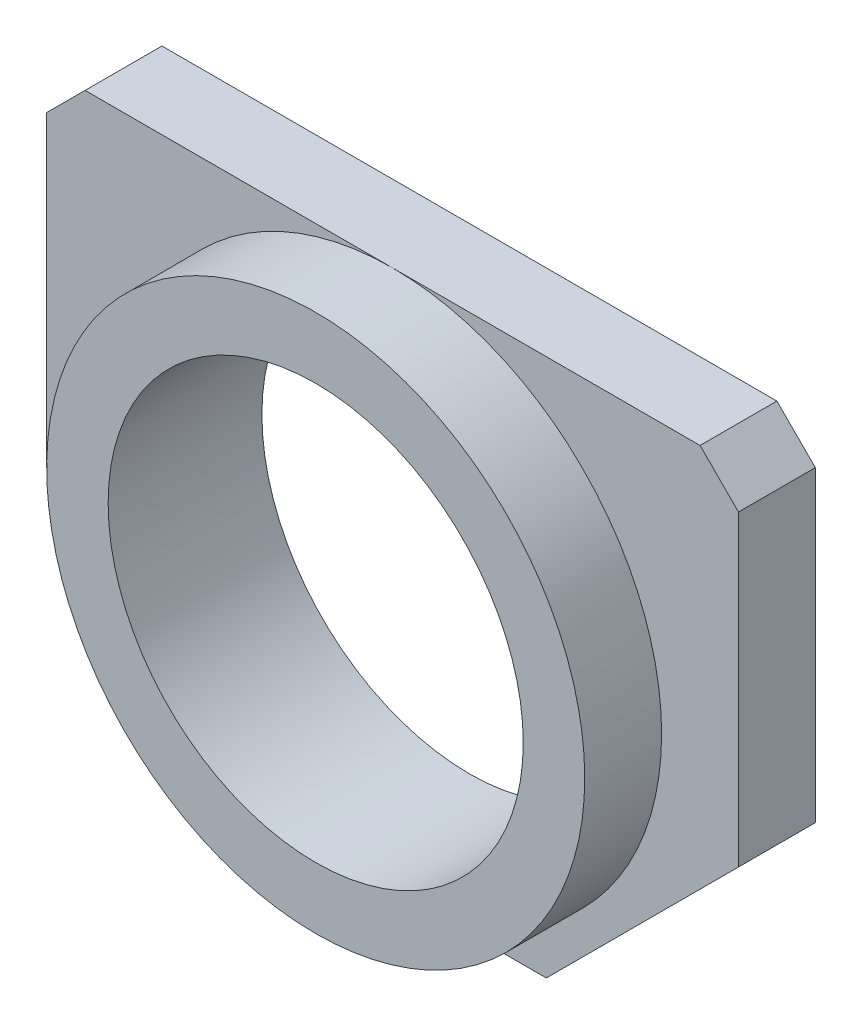
ISO-10303-21;
HEADER;
FILE_DESCRIPTION(('STEP AP214'),'2;1');
FILE_NAME('part.step','',(''),(''),'','','');
FILE_SCHEMA(('AUTOMOTIVE_DESIGN { 1 0 10303 214 1 1 1 1 }'));
ENDSEC;
DATA;
#1=APPLICATION_CONTEXT('core data for automotive mechanical design processes');
#2=APPLICATION_PROTOCOL_DEFINITION('international standard','automotive_design',2000,#1);
#3=PRODUCT_CONTEXT('',#1,'mechanical');
#4=PRODUCT('Part','Part','',(#3));
#5=PRODUCT_RELATED_PRODUCT_CATEGORY('part','',(#4));
#6=PRODUCT_DEFINITION_FORMATION('','',#4);
#7=PRODUCT_DEFINITION_CONTEXT('part definition',#1,'design');
#8=PRODUCT_DEFINITION('design','',#6,#7);
#9=PRODUCT_DEFINITION_SHAPE('','',#8);
#10=(LENGTH_UNIT() NAMED_UNIT(*) SI_UNIT(.MILLI.,.METRE.));
#11=(NAMED_UNIT(*) PLANE_ANGLE_UNIT() SI_UNIT($,.RADIAN.));
#12=(NAMED_UNIT(*) SI_UNIT($,.STERADIAN.) SOLID_ANGLE_UNIT());
#13=UNCERTAINTY_MEASURE_WITH_UNIT(LENGTH_MEASURE(1.E-05),#10,'distance_accuracy_value','');
#14=(GEOMETRIC_REPRESENTATION_CONTEXT(3) GLOBAL_UNCERTAINTY_ASSIGNED_CONTEXT((#13)) GLOBAL_UNIT_ASSIGNED_CONTEXT((#10,
#11,#12)) REPRESENTATION_CONTEXT('',''));
#15=CARTESIAN_POINT('',(0.,0.,0.));
#16=DIRECTION('',(0.,0.,1.));
#17=DIRECTION('',(1.,0.,0.));
#18=AXIS2_PLACEMENT_3D('',#15,#16,#17);
#19=CARTESIAN_POINT('',(9.,7.,2.));
#20=DIRECTION('',(0.,0.,-1.));
#21=DIRECTION('',(-1.,0.,0.));
#22=AXIS2_PLACEMENT_3D('',#19,#20,#21);
#23=PLANE('',#22);
#24=DIRECTION('',(-1.,0.,0.));
#25=VECTOR('',#24,1.);
#26=CARTESIAN_POINT('',(-9.,7.,2.));
#27=LINE('',#26,#25);
#28=CARTESIAN_POINT('',(0.,7.,2.));
#29=VERTEX_POINT('',#28);
#30=CARTESIAN_POINT('',(-8.,7.,2.));
#31=VERTEX_POINT('',#30);
#32=EDGE_CURVE('E116',#29,#31,#27,.T.);
#33=ORIENTED_EDGE('',*,*,#32,.T.);
#34=DIRECTION('',(0.707106781186548,0.707106781186548,0.));
#35=VECTOR('',#34,1.);
#36=CARTESIAN_POINT('',(-9.,6.,2.));
#37=LINE('',#36,#35);
#38=CARTESIAN_POINT('',(-9.00000000000001,5.99999999999999,2.));
#39=VERTEX_POINT('',#38);
#40=EDGE_CURVE('E11',#31,#39,#37,.F.);
#41=ORIENTED_EDGE('',*,*,#40,.T.);
#42=DIRECTION('',(0.,-1.,0.));
#43=VECTOR('',#42,1.);
#44=CARTESIAN_POINT('',(-9.,-7.,2.));
#45=LINE('',#44,#43);
#46=CARTESIAN_POINT('',(-9.00000000000001,-1.99999999999998,2.));
#47=VERTEX_POINT('',#46);
#48=EDGE_CURVE('E115',#39,#47,#45,.T.);
#49=ORIENTED_EDGE('',*,*,#48,.T.);
#50=DIRECTION('',(-0.707106781186546,0.707106781186549,0.));
#51=VECTOR('',#50,1.);
#52=CARTESIAN_POINT('',(-4.,-7.,2.));
#53=LINE('',#52,#51);
#54=CARTESIAN_POINT('',(-4.,-7.,2.));
#55=VERTEX_POINT('',#54);
#56=EDGE_CURVE('E167',#47,#55,#53,.F.);
#57=ORIENTED_EDGE('',*,*,#56,.T.);
#58=DIRECTION('',(1.,0.,0.));
#59=VECTOR('',#58,1.);
#60=CARTESIAN_POINT('',(-9.,-7.,2.));
#61=LINE('',#60,#59);
#62=CARTESIAN_POINT('',(0.,-7.,2.));
#63=VERTEX_POINT('',#62);
#64=EDGE_CURVE('E127',#55,#63,#61,.T.);
#65=ORIENTED_EDGE('',*,*,#64,.T.);
#66=CARTESIAN_POINT('',(0.,0.,2.));
#67=DIRECTION('',(0.,0.,1.));
#68=DIRECTION('',(1.,0.,0.));
#69=AXIS2_PLACEMENT_3D('',#66,#67,#68);
#70=CIRCLE('',#69,7.);
#71=EDGE_CURVE('E125',#29,#63,#70,.T.);
#72=ORIENTED_EDGE('',*,*,#71,.F.);
#73=EDGE_LOOP('',(#33,#41,#49,#57,#65,#72));
#74=FACE_BOUND('',#73,.T.);
#75=ADVANCED_FACE('F31',(#74),#23,.F.);
#76=DIRECTION('',(0.,1.,0.));
#77=VECTOR('',#76,1.);
#78=CARTESIAN_POINT('',(9.,-7.,2.));
#79=LINE('',#78,#77);
#80=CARTESIAN_POINT('',(9.,-2.,2.));
#81=VERTEX_POINT('',#80);
#82=CARTESIAN_POINT('',(9.,5.99999999999999,2.));
#83=VERTEX_POINT('',#82);
#84=EDGE_CURVE('E123',#81,#83,#79,.T.);
#85=ORIENTED_EDGE('',*,*,#84,.T.);
#86=DIRECTION('',(0.707106781186546,-0.707106781186549,0.));
#87=VECTOR('',#86,1.);
#88=CARTESIAN_POINT('',(7.99999999999999,7.,2.));
#89=LINE('',#88,#87);
#90=CARTESIAN_POINT('',(7.99999999999999,7.,2.));
#91=VERTEX_POINT('',#90);
#92=EDGE_CURVE('E111',#83,#91,#89,.F.);
#93=ORIENTED_EDGE('',*,*,#92,.T.);
#94=EDGE_CURVE('E103',#91,#29,#27,.T.);
#95=ORIENTED_EDGE('',*,*,#94,.T.);
#96=EDGE_CURVE('E108',#63,#29,#70,.T.);
#97=ORIENTED_EDGE('',*,*,#96,.F.);
#98=CARTESIAN_POINT('',(3.99999999999997,-7.,2.));
#99=VERTEX_POINT('',#98);
#100=EDGE_CURVE('E137',#63,#99,#61,.T.);
#101=ORIENTED_EDGE('',*,*,#100,.T.);
#102=DIRECTION('',(-0.707106781186549,-0.707106781186546,0.));
#103=VECTOR('',#102,1.);
#104=CARTESIAN_POINT('',(9.,-2.,2.));
#105=LINE('',#104,#103);
#106=EDGE_CURVE('E162',#99,#81,#105,.F.);
#107=ORIENTED_EDGE('',*,*,#106,.T.);
#108=EDGE_LOOP('',(#85,#93,#95,#97,#101,#107));
#109=FACE_BOUND('',#108,.T.);
#110=ADVANCED_FACE('F105',(#109),#23,.F.);
#111=CARTESIAN_POINT('',(9.,-7.,2.));
#112=DIRECTION('',(-1.,0.,0.));
#113=DIRECTION('',(0.,0.,1.));
#114=AXIS2_PLACEMENT_3D('',#111,#112,#113);
#115=PLANE('',#114);
#116=DIRECTION('',(0.,1.,0.));
#117=VECTOR('',#116,1.);
#118=CARTESIAN_POINT('',(9.,-7.,0.));
#119=LINE('',#118,#117);
#120=CARTESIAN_POINT('',(8.99999999999999,-2.,0.));
#121=VERTEX_POINT('',#120);
#122=CARTESIAN_POINT('',(9.,5.99999999999999,0.));
#123=VERTEX_POINT('',#122);
#124=EDGE_CURVE('E145',#121,#123,#119,.T.);
#125=ORIENTED_EDGE('',*,*,#124,.T.);
#126=DIRECTION('',(0.,0.,1.));
#127=VECTOR('',#126,1.);
#128=CARTESIAN_POINT('',(9.,5.99999999999999,2.));
#129=LINE('',#128,#127);
#130=EDGE_CURVE('E52',#123,#83,#129,.T.);
#131=ORIENTED_EDGE('',*,*,#130,.T.);
#132=ORIENTED_EDGE('',*,*,#84,.F.);
#133=DIRECTION('',(0.,0.,-1.));
#134=VECTOR('',#133,1.);
#135=CARTESIAN_POINT('',(9.,-2.,2.));
#136=LINE('',#135,#134);
#137=EDGE_CURVE('E133',#81,#121,#136,.T.);
#138=ORIENTED_EDGE('',*,*,#137,.T.);
#139=EDGE_LOOP('',(#125,#131,#132,#138));
#140=FACE_BOUND('',#139,.T.);
#141=ADVANCED_FACE('F200',(#140),#115,.F.);
#142=CARTESIAN_POINT('',(-9.,7.,2.));
#143=DIRECTION('',(0.,-1.,0.));
#144=DIRECTION('',(0.,0.,-1.));
#145=AXIS2_PLACEMENT_3D('',#142,#143,#144);
#146=PLANE('',#145);
#147=ORIENTED_EDGE('',*,*,#94,.F.);
#148=DIRECTION('',(0.,0.,-1.));
#149=VECTOR('',#148,1.);
#150=CARTESIAN_POINT('',(7.99999999999999,7.,2.));
#151=LINE('',#150,#149);
#152=CARTESIAN_POINT('',(7.99999999999999,7.,0.));
#153=VERTEX_POINT('',#152);
#154=EDGE_CURVE('E170',#91,#153,#151,.T.);
#155=ORIENTED_EDGE('',*,*,#154,.T.);
#156=DIRECTION('',(-1.,0.,0.));
#157=VECTOR('',#156,1.);
#158=CARTESIAN_POINT('',(-9.,7.,0.));
#159=LINE('',#158,#157);
#160=CARTESIAN_POINT('',(-8.,7.,0.));
#161=VERTEX_POINT('',#160);
#162=EDGE_CURVE('E147',#153,#161,#159,.T.);
#163=ORIENTED_EDGE('',*,*,#162,.T.);
#164=DIRECTION('',(0.,0.,1.));
#165=VECTOR('',#164,1.);
#166=CARTESIAN_POINT('',(-8.,7.,2.));
#167=LINE('',#166,#165);
#168=EDGE_CURVE('E122',#161,#31,#167,.T.);
#169=ORIENTED_EDGE('',*,*,#168,.T.);
#170=ORIENTED_EDGE('',*,*,#32,.F.);
#171=EDGE_LOOP('',(#147,#155,#163,#169,#170));
#172=FACE_BOUND('',#171,.T.);
#173=ADVANCED_FACE('F119',(#172),#146,.F.);
#174=CARTESIAN_POINT('',(-9.,-7.,2.));
#175=DIRECTION('',(1.,0.,0.));
#176=DIRECTION('',(0.,0.,-1.));
#177=AXIS2_PLACEMENT_3D('',#174,#175,#176);
#178=PLANE('',#177);
#179=ORIENTED_EDGE('',*,*,#48,.F.);
#180=DIRECTION('',(0.,0.,-1.));
#181=VECTOR('',#180,1.);
#182=CARTESIAN_POINT('',(-9.,6.,2.));
#183=LINE('',#182,#181);
#184=CARTESIAN_POINT('',(-9.00000000000001,5.99999999999999,0.));
#185=VERTEX_POINT('',#184);
#186=EDGE_CURVE('E39',#39,#185,#183,.T.);
#187=ORIENTED_EDGE('',*,*,#186,.T.);
#188=DIRECTION('',(0.,-1.,0.));
#189=VECTOR('',#188,1.);
#190=CARTESIAN_POINT('',(-9.,-7.,0.));
#191=LINE('',#190,#189);
#192=CARTESIAN_POINT('',(-9.,-1.99999999999998,0.));
#193=VERTEX_POINT('',#192);
#194=EDGE_CURVE('E149',#185,#193,#191,.T.);
#195=ORIENTED_EDGE('',*,*,#194,.T.);
#196=DIRECTION('',(0.,0.,1.));
#197=VECTOR('',#196,1.);
#198=CARTESIAN_POINT('',(-9.,-1.99999999999998,2.));
#199=LINE('',#198,#197);
#200=EDGE_CURVE('E164',#193,#47,#199,.T.);
#201=ORIENTED_EDGE('',*,*,#200,.T.);
#202=EDGE_LOOP('',(#179,#187,#195,#201));
#203=FACE_BOUND('',#202,.T.);
#204=ADVANCED_FACE('F181',(#203),#178,.F.);
#205=CARTESIAN_POINT('',(-9.,-7.,2.));
#206=DIRECTION('',(0.,1.,0.));
#207=DIRECTION('',(0.,0.,1.));
#208=AXIS2_PLACEMENT_3D('',#205,#206,#207);
#209=PLANE('',#208);
#210=DIRECTION('',(1.,0.,0.));
#211=VECTOR('',#210,1.);
#212=CARTESIAN_POINT('',(-9.,-7.,0.));
#213=LINE('',#212,#211);
#214=CARTESIAN_POINT('',(-4.00000000000001,-7.,0.));
#215=VERTEX_POINT('',#214);
#216=CARTESIAN_POINT('',(3.99999999999997,-7.,0.));
#217=VERTEX_POINT('',#216);
#218=EDGE_CURVE('E142',#215,#217,#213,.T.);
#219=ORIENTED_EDGE('',*,*,#218,.T.);
#220=DIRECTION('',(0.,0.,1.));
#221=VECTOR('',#220,1.);
#222=CARTESIAN_POINT('',(3.99999999999997,-7.,2.));
#223=LINE('',#222,#221);
#224=EDGE_CURVE('E160',#217,#99,#223,.T.);
#225=ORIENTED_EDGE('',*,*,#224,.T.);
#226=ORIENTED_EDGE('',*,*,#100,.F.);
#227=ORIENTED_EDGE('',*,*,#64,.F.);
#228=DIRECTION('',(0.,0.,-1.));
#229=VECTOR('',#228,1.);
#230=CARTESIAN_POINT('',(-4.,-7.,2.));
#231=LINE('',#230,#229);
#232=EDGE_CURVE('E157',#55,#215,#231,.T.);
#233=ORIENTED_EDGE('',*,*,#232,.T.);
#234=EDGE_LOOP('',(#219,#225,#226,#227,#233));
#235=FACE_BOUND('',#234,.T.);
#236=ADVANCED_FACE('F193',(#235),#209,.F.);
#237=CARTESIAN_POINT('',(9.,7.,0.));
#238=DIRECTION('',(0.,0.,-1.));
#239=DIRECTION('',(-1.,0.,0.));
#240=AXIS2_PLACEMENT_3D('',#237,#238,#239);
#241=PLANE('',#240);
#242=CARTESIAN_POINT('',(0.,0.,0.));
#243=DIRECTION('',(0.,0.,-1.));
#244=DIRECTION('',(-1.,0.,0.));
#245=AXIS2_PLACEMENT_3D('',#242,#243,#244);
#246=CIRCLE('',#245,5.4);
#247=CARTESIAN_POINT('',(-5.4,0.,0.));
#248=VERTEX_POINT('',#247);
#249=EDGE_CURVE('E130',#248,#248,#246,.T.);
#250=ORIENTED_EDGE('',*,*,#249,.F.);
#251=EDGE_LOOP('',(#250));
#252=FACE_BOUND('',#251,.T.);
#253=ORIENTED_EDGE('',*,*,#162,.F.);
#254=DIRECTION('',(-0.707106781186546,0.707106781186549,0.));
#255=VECTOR('',#254,1.);
#256=CARTESIAN_POINT('',(8.49999999999999,6.5,0.));
#257=LINE('',#256,#255);
#258=EDGE_CURVE('E174',#153,#123,#257,.F.);
#259=ORIENTED_EDGE('',*,*,#258,.T.);
#260=ORIENTED_EDGE('',*,*,#124,.F.);
#261=DIRECTION('',(0.707106781186549,0.707106781186546,0.));
#262=VECTOR('',#261,1.);
#263=CARTESIAN_POINT('',(13.5,2.49999999999998,0.));
#264=LINE('',#263,#262);
#265=EDGE_CURVE('E155',#121,#217,#264,.F.);
#266=ORIENTED_EDGE('',*,*,#265,.T.);
#267=ORIENTED_EDGE('',*,*,#218,.F.);
#268=DIRECTION('',(0.707106781186546,-0.707106781186549,0.));
#269=VECTOR('',#268,1.);
#270=CARTESIAN_POINT('',(-4.50000000000003,-6.49999999999997,0.));
#271=LINE('',#270,#269);
#272=EDGE_CURVE('E135',#215,#193,#271,.F.);
#273=ORIENTED_EDGE('',*,*,#272,.T.);
#274=ORIENTED_EDGE('',*,*,#194,.F.);
#275=DIRECTION('',(-0.707106781186548,-0.707106781186548,0.));
#276=VECTOR('',#275,1.);
#277=CARTESIAN_POINT('',(0.499999999999997,15.5,0.));
#278=LINE('',#277,#276);
#279=EDGE_CURVE('E172',#185,#161,#278,.F.);
#280=ORIENTED_EDGE('',*,*,#279,.T.);
#281=EDGE_LOOP('',(#253,#259,#260,#266,#267,#273,#274,#280));
#282=FACE_BOUND('',#281,.T.);
#283=ADVANCED_FACE('F185',(#252,#282),#241,.T.);
#284=CARTESIAN_POINT('',(0.,0.,4.));
#285=DIRECTION('',(0.,0.,-1.));
#286=DIRECTION('',(-1.,0.,0.));
#287=AXIS2_PLACEMENT_3D('',#284,#285,#286);
#288=CYLINDRICAL_SURFACE('',#287,7.);
#289=CARTESIAN_POINT('',(0.,0.,4.));
#290=DIRECTION('',(0.,0.,1.));
#291=DIRECTION('',(1.,0.,0.));
#292=AXIS2_PLACEMENT_3D('',#289,#290,#291);
#293=CIRCLE('',#292,7.);
#294=CARTESIAN_POINT('',(7.,0.,4.));
#295=VERTEX_POINT('',#294);
#296=EDGE_CURVE('E129',#295,#295,#293,.T.);
#297=ORIENTED_EDGE('',*,*,#296,.F.);
#298=EDGE_LOOP('',(#297));
#299=FACE_BOUND('',#298,.T.);
#300=ORIENTED_EDGE('',*,*,#71,.T.);
#301=ORIENTED_EDGE('',*,*,#96,.T.);
#302=EDGE_LOOP('',(#300,#301));
#303=FACE_BOUND('',#302,.T.);
#304=ADVANCED_FACE('F132',(#299,#303),#288,.T.);
#305=CARTESIAN_POINT('',(0.,0.,4.));
#306=DIRECTION('',(0.,0.,1.));
#307=DIRECTION('',(1.,0.,0.));
#308=AXIS2_PLACEMENT_3D('',#305,#306,#307);
#309=PLANE('',#308);
#310=CARTESIAN_POINT('',(0.,0.,4.));
#311=DIRECTION('',(0.,0.,1.));
#312=DIRECTION('',(1.,0.,0.));
#313=AXIS2_PLACEMENT_3D('',#310,#311,#312);
#314=CIRCLE('',#313,5.4);
#315=CARTESIAN_POINT('',(5.4,0.,4.));
#316=VERTEX_POINT('',#315);
#317=EDGE_CURVE('E323',#316,#316,#314,.T.);
#318=ORIENTED_EDGE('',*,*,#317,.F.);
#319=EDGE_LOOP('',(#318));
#320=FACE_BOUND('',#319,.T.);
#321=ORIENTED_EDGE('',*,*,#296,.T.);
#322=EDGE_LOOP('',(#321));
#323=FACE_BOUND('',#322,.T.);
#324=ADVANCED_FACE('F288',(#320,#323),#309,.T.);
#325=CARTESIAN_POINT('',(0.,0.,4.));
#326=DIRECTION('',(0.,0.,1.));
#327=DIRECTION('',(1.,0.,0.));
#328=AXIS2_PLACEMENT_3D('',#325,#326,#327);
#329=CYLINDRICAL_SURFACE('',#328,5.4);
#330=ORIENTED_EDGE('',*,*,#249,.T.);
#331=EDGE_LOOP('',(#330));
#332=FACE_BOUND('',#331,.T.);
#333=ORIENTED_EDGE('',*,*,#317,.T.);
#334=EDGE_LOOP('',(#333));
#335=FACE_BOUND('',#334,.T.);
#336=ADVANCED_FACE('F228',(#332,#335),#329,.F.);
#337=CARTESIAN_POINT('',(9.,-2.,2.));
#338=DIRECTION('',(-0.707106781186546,0.707106781186549,0.));
#339=DIRECTION('',(-0.707106781186549,-0.707106781186546,0.));
#340=AXIS2_PLACEMENT_3D('',#337,#338,#339);
#341=PLANE('',#340);
#342=ORIENTED_EDGE('',*,*,#106,.F.);
#343=ORIENTED_EDGE('',*,*,#224,.F.);
#344=ORIENTED_EDGE('',*,*,#265,.F.);
#345=ORIENTED_EDGE('',*,*,#137,.F.);
#346=EDGE_LOOP('',(#342,#343,#344,#345));
#347=FACE_BOUND('',#346,.T.);
#348=ADVANCED_FACE('F198',(#347),#341,.F.);
#349=CARTESIAN_POINT('',(-4.,-7.,2.));
#350=DIRECTION('',(0.707106781186549,0.707106781186546,0.));
#351=DIRECTION('',(-0.707106781186546,0.707106781186549,0.));
#352=AXIS2_PLACEMENT_3D('',#349,#350,#351);
#353=PLANE('',#352);
#354=ORIENTED_EDGE('',*,*,#56,.F.);
#355=ORIENTED_EDGE('',*,*,#200,.F.);
#356=ORIENTED_EDGE('',*,*,#272,.F.);
#357=ORIENTED_EDGE('',*,*,#232,.F.);
#358=EDGE_LOOP('',(#354,#355,#356,#357));
#359=FACE_BOUND('',#358,.T.);
#360=ADVANCED_FACE('F191',(#359),#353,.F.);
#361=CARTESIAN_POINT('',(7.99999999999999,7.,2.));
#362=DIRECTION('',(-0.707106781186549,-0.707106781186546,0.));
#363=DIRECTION('',(0.707106781186546,-0.707106781186549,0.));
#364=AXIS2_PLACEMENT_3D('',#361,#362,#363);
#365=PLANE('',#364);
#366=ORIENTED_EDGE('',*,*,#92,.F.);
#367=ORIENTED_EDGE('',*,*,#130,.F.);
#368=ORIENTED_EDGE('',*,*,#258,.F.);
#369=ORIENTED_EDGE('',*,*,#154,.F.);
#370=EDGE_LOOP('',(#366,#367,#368,#369));
#371=FACE_BOUND('',#370,.T.);
#372=ADVANCED_FACE('F202',(#371),#365,.F.);
#373=CARTESIAN_POINT('',(-9.,6.,2.));
#374=DIRECTION('',(0.707106781186547,-0.707106781186547,0.));
#375=DIRECTION('',(0.707106781186548,0.707106781186548,0.));
#376=AXIS2_PLACEMENT_3D('',#373,#374,#375);
#377=PLANE('',#376);
#378=ORIENTED_EDGE('',*,*,#40,.F.);
#379=ORIENTED_EDGE('',*,*,#168,.F.);
#380=ORIENTED_EDGE('',*,*,#279,.F.);
#381=ORIENTED_EDGE('',*,*,#186,.F.);
#382=EDGE_LOOP('',(#378,#379,#380,#381));
#383=FACE_BOUND('',#382,.T.);
#384=ADVANCED_FACE('F33',(#383),#377,.F.);
#385=CLOSED_SHELL('',(#75,#110,#141,#173,#204,#236,#283,#304,#324,#336,#348,#360,#372,#384));
#386=MANIFOLD_SOLID_BREP('B2',#385);
#387=ADVANCED_BREP_SHAPE_REPRESENTATION('',(#18,#386),#14);
#388=SHAPE_DEFINITION_REPRESENTATION(#9,#387);
ENDSEC;
END-ISO-10303-21;
